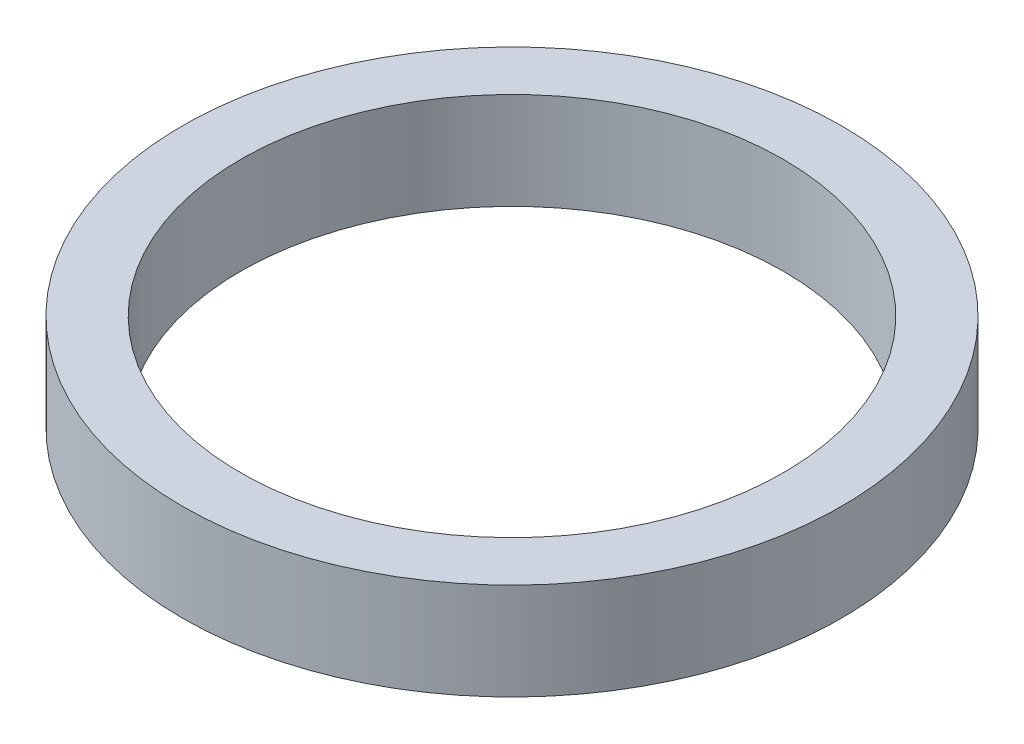
ISO-10303-21;
HEADER;
FILE_DESCRIPTION(('STEP AP214'),'2;1');
FILE_NAME('part.step','',(''),(''),'','','');
FILE_SCHEMA(('AUTOMOTIVE_DESIGN { 1 0 10303 214 1 1 1 1 }'));
ENDSEC;
DATA;
#1=APPLICATION_CONTEXT('core data for automotive mechanical design processes');
#2=APPLICATION_PROTOCOL_DEFINITION('international standard','automotive_design',2000,#1);
#3=PRODUCT_CONTEXT('',#1,'mechanical');
#4=PRODUCT('Part','Part','',(#3));
#5=PRODUCT_RELATED_PRODUCT_CATEGORY('part','',(#4));
#6=PRODUCT_DEFINITION_FORMATION('','',#4);
#7=PRODUCT_DEFINITION_CONTEXT('part definition',#1,'design');
#8=PRODUCT_DEFINITION('design','',#6,#7);
#9=PRODUCT_DEFINITION_SHAPE('','',#8);
#10=(LENGTH_UNIT() NAMED_UNIT(*) SI_UNIT(.MILLI.,.METRE.));
#11=(NAMED_UNIT(*) PLANE_ANGLE_UNIT() SI_UNIT($,.RADIAN.));
#12=(NAMED_UNIT(*) SI_UNIT($,.STERADIAN.) SOLID_ANGLE_UNIT());
#13=UNCERTAINTY_MEASURE_WITH_UNIT(LENGTH_MEASURE(1.E-05),#10,'distance_accuracy_value','');
#14=(GEOMETRIC_REPRESENTATION_CONTEXT(3) GLOBAL_UNCERTAINTY_ASSIGNED_CONTEXT((#13)) GLOBAL_UNIT_ASSIGNED_CONTEXT((#10,
#11,#12)) REPRESENTATION_CONTEXT('',''));
#15=CARTESIAN_POINT('',(0.,0.,0.));
#16=DIRECTION('',(0.,0.,1.));
#17=DIRECTION('',(1.,0.,0.));
#18=AXIS2_PLACEMENT_3D('',#15,#16,#17);
#19=CARTESIAN_POINT('',(8.84,11.75,8.84));
#20=DIRECTION('',(0.,-1.,0.));
#21=DIRECTION('',(-1.,0.,0.));
#22=AXIS2_PLACEMENT_3D('',#19,#20,#21);
#23=PLANE('',#22);
#24=CARTESIAN_POINT('',(0.,11.75,0.));
#25=DIRECTION('',(0.,-1.,0.));
#26=DIRECTION('',(0.,0.,-1.));
#27=AXIS2_PLACEMENT_3D('',#24,#25,#26);
#28=CIRCLE('',#27,7.);
#29=CARTESIAN_POINT('',(0.,11.75,-7.));
#30=VERTEX_POINT('',#29);
#31=EDGE_CURVE('E28',#30,#30,#28,.F.);
#32=ORIENTED_EDGE('',*,*,#31,.T.);
#33=EDGE_LOOP('',(#32));
#34=FACE_BOUND('',#33,.T.);
#35=CARTESIAN_POINT('',(0.,11.75,0.));
#36=DIRECTION('',(0.,-1.,0.));
#37=DIRECTION('',(0.,0.,-1.));
#38=AXIS2_PLACEMENT_3D('',#35,#36,#37);
#39=CIRCLE('',#38,8.5);
#40=CARTESIAN_POINT('',(0.,11.75,-8.5));
#41=VERTEX_POINT('',#40);
#42=EDGE_CURVE('E19',#41,#41,#39,.T.);
#43=ORIENTED_EDGE('',*,*,#42,.T.);
#44=EDGE_LOOP('',(#43));
#45=FACE_BOUND('',#44,.T.);
#46=ADVANCED_FACE('F15',(#34,#45),#23,.T.);
#47=CARTESIAN_POINT('',(0.,14.25,0.));
#48=DIRECTION('',(0.,-1.,0.));
#49=DIRECTION('',(0.,0.,-1.));
#50=AXIS2_PLACEMENT_3D('',#47,#48,#49);
#51=CYLINDRICAL_SURFACE('',#50,8.5);
#52=ORIENTED_EDGE('',*,*,#42,.F.);
#53=EDGE_LOOP('',(#52));
#54=FACE_BOUND('',#53,.T.);
#55=CARTESIAN_POINT('',(0.,14.25,0.));
#56=DIRECTION('',(0.,-1.,0.));
#57=DIRECTION('',(0.,0.,-1.));
#58=AXIS2_PLACEMENT_3D('',#55,#56,#57);
#59=CIRCLE('',#58,8.5);
#60=CARTESIAN_POINT('',(0.,14.25,-8.5));
#61=VERTEX_POINT('',#60);
#62=EDGE_CURVE('E23',#61,#61,#59,.T.);
#63=ORIENTED_EDGE('',*,*,#62,.T.);
#64=EDGE_LOOP('',(#63));
#65=FACE_BOUND('',#64,.T.);
#66=ADVANCED_FACE('F37',(#54,#65),#51,.T.);
#67=CARTESIAN_POINT('',(0.,14.25,0.));
#68=DIRECTION('',(0.,-1.,0.));
#69=DIRECTION('',(0.,0.,-1.));
#70=AXIS2_PLACEMENT_3D('',#67,#68,#69);
#71=CYLINDRICAL_SURFACE('',#70,7.);
#72=ORIENTED_EDGE('',*,*,#31,.F.);
#73=EDGE_LOOP('',(#72));
#74=FACE_BOUND('',#73,.T.);
#75=CARTESIAN_POINT('',(0.,14.25,0.));
#76=DIRECTION('',(0.,-1.,0.));
#77=DIRECTION('',(0.,0.,-1.));
#78=AXIS2_PLACEMENT_3D('',#75,#76,#77);
#79=CIRCLE('',#78,7.);
#80=CARTESIAN_POINT('',(0.,14.25,-7.));
#81=VERTEX_POINT('',#80);
#82=EDGE_CURVE('E10',#81,#81,#79,.F.);
#83=ORIENTED_EDGE('',*,*,#82,.T.);
#84=EDGE_LOOP('',(#83));
#85=FACE_BOUND('',#84,.T.);
#86=ADVANCED_FACE('F40',(#74,#85),#71,.F.);
#87=CARTESIAN_POINT('',(8.84,14.25,8.84));
#88=DIRECTION('',(0.,-1.,0.));
#89=DIRECTION('',(-1.,0.,0.));
#90=AXIS2_PLACEMENT_3D('',#87,#88,#89);
#91=PLANE('',#90);
#92=ORIENTED_EDGE('',*,*,#82,.F.);
#93=EDGE_LOOP('',(#92));
#94=FACE_BOUND('',#93,.T.);
#95=ORIENTED_EDGE('',*,*,#62,.F.);
#96=EDGE_LOOP('',(#95));
#97=FACE_BOUND('',#96,.T.);
#98=ADVANCED_FACE('F17',(#94,#97),#91,.F.);
#99=CLOSED_SHELL('',(#46,#66,#86,#98));
#100=MANIFOLD_SOLID_BREP('B1',#99);
#101=ADVANCED_BREP_SHAPE_REPRESENTATION('',(#18,#100),#14);
#102=SHAPE_DEFINITION_REPRESENTATION(#9,#101);
ENDSEC;
END-ISO-10303-21;
